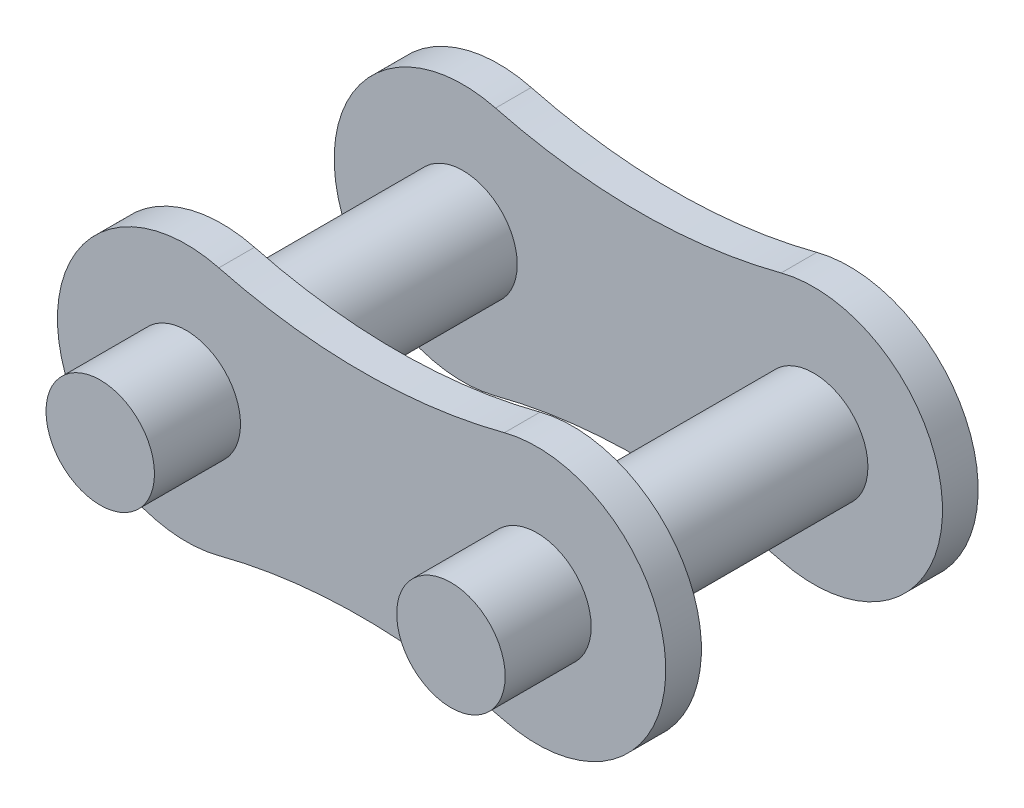
ISO-10303-21;
HEADER;
FILE_DESCRIPTION(('STEP AP214'),'2;1');
FILE_NAME('part.step','',(''),(''),'','','');
FILE_SCHEMA(('AUTOMOTIVE_DESIGN { 1 0 10303 214 1 1 1 1 }'));
ENDSEC;
DATA;
#1=APPLICATION_CONTEXT('core data for automotive mechanical design processes');
#2=APPLICATION_PROTOCOL_DEFINITION('international standard','automotive_design',2000,#1);
#3=PRODUCT_CONTEXT('',#1,'mechanical');
#4=PRODUCT('Part','Part','',(#3));
#5=PRODUCT_RELATED_PRODUCT_CATEGORY('part','',(#4));
#6=PRODUCT_DEFINITION_FORMATION('','',#4);
#7=PRODUCT_DEFINITION_CONTEXT('part definition',#1,'design');
#8=PRODUCT_DEFINITION('design','',#6,#7);
#9=PRODUCT_DEFINITION_SHAPE('','',#8);
#10=(LENGTH_UNIT() NAMED_UNIT(*) SI_UNIT(.MILLI.,.METRE.));
#11=(NAMED_UNIT(*) PLANE_ANGLE_UNIT() SI_UNIT($,.RADIAN.));
#12=(NAMED_UNIT(*) SI_UNIT($,.STERADIAN.) SOLID_ANGLE_UNIT());
#13=UNCERTAINTY_MEASURE_WITH_UNIT(LENGTH_MEASURE(1.E-05),#10,'distance_accuracy_value','');
#14=(GEOMETRIC_REPRESENTATION_CONTEXT(3) GLOBAL_UNCERTAINTY_ASSIGNED_CONTEXT((#13)) GLOBAL_UNIT_ASSIGNED_CONTEXT((#10,
#11,#12)) REPRESENTATION_CONTEXT('',''));
#15=CARTESIAN_POINT('',(0.,0.,0.));
#16=DIRECTION('',(0.,0.,1.));
#17=DIRECTION('',(1.,0.,0.));
#18=AXIS2_PLACEMENT_3D('',#15,#16,#17);
#19=CARTESIAN_POINT('',(5.9944,11.4708256819023,-2.67));
#20=DIRECTION('',(0.,0.,1.));
#21=DIRECTION('',(1.,0.,0.));
#22=AXIS2_PLACEMENT_3D('',#19,#20,#21);
#23=CYLINDRICAL_SURFACE('',#22,9.6542568824027);
#24=CARTESIAN_POINT('',(5.9944,11.4708256819023,-2.0604));
#25=DIRECTION('',(0.,0.,-1.));
#26=DIRECTION('',(1.,0.,0.));
#27=AXIS2_PLACEMENT_3D('',#24,#25,#26);
#28=CIRCLE('',#27,9.6542568824027);
#29=CARTESIAN_POINT('',(8.43501338550079,2.13015749092509,-2.0604));
#30=VERTEX_POINT('',#29);
#31=CARTESIAN_POINT('',(3.55378661449922,2.13015749092509,-2.0604));
#32=VERTEX_POINT('',#31);
#33=EDGE_CURVE('E161',#30,#32,#28,.T.);
#34=ORIENTED_EDGE('',*,*,#33,.F.);
#35=DIRECTION('',(0.,0.,1.));
#36=VECTOR('',#35,1.);
#37=CARTESIAN_POINT('',(8.43501338550079,2.13015749092509,-2.67));
#38=LINE('',#37,#36);
#39=CARTESIAN_POINT('',(8.43501338550079,2.13015749092509,-2.67));
#40=VERTEX_POINT('',#39);
#41=EDGE_CURVE('E11',#40,#30,#38,.T.);
#42=ORIENTED_EDGE('',*,*,#41,.F.);
#43=CARTESIAN_POINT('',(5.9944,11.4708256819023,-2.67));
#44=DIRECTION('',(0.,0.,-1.));
#45=DIRECTION('',(1.,0.,0.));
#46=AXIS2_PLACEMENT_3D('',#43,#44,#45);
#47=CIRCLE('',#46,9.6542568824027);
#48=CARTESIAN_POINT('',(3.55378661449922,2.13015749092509,-2.67));
#49=VERTEX_POINT('',#48);
#50=EDGE_CURVE('E162',#40,#49,#47,.T.);
#51=ORIENTED_EDGE('',*,*,#50,.T.);
#52=DIRECTION('',(0.,0.,1.));
#53=VECTOR('',#52,1.);
#54=CARTESIAN_POINT('',(3.55378661449922,2.13015749092509,-2.67));
#55=LINE('',#54,#53);
#56=EDGE_CURVE('E39',#49,#32,#55,.T.);
#57=ORIENTED_EDGE('',*,*,#56,.T.);
#58=EDGE_LOOP('',(#34,#42,#51,#57));
#59=FACE_BOUND('',#58,.T.);
#60=ADVANCED_FACE('F36',(#59),#23,.F.);
#61=CARTESIAN_POINT('',(8.9916,0.,-2.67));
#62=DIRECTION('',(0.,0.,1.));
#63=DIRECTION('',(1.,0.,0.));
#64=AXIS2_PLACEMENT_3D('',#61,#62,#63);
#65=CYLINDRICAL_SURFACE('',#64,2.20167199999999);
#66=CARTESIAN_POINT('',(8.9916,0.,-2.0604));
#67=DIRECTION('',(0.,0.,1.));
#68=DIRECTION('',(1.,0.,0.));
#69=AXIS2_PLACEMENT_3D('',#66,#67,#68);
#70=CIRCLE('',#69,2.20167199999999);
#71=CARTESIAN_POINT('',(8.43501338550078,-2.13015749092509,-2.0604));
#72=VERTEX_POINT('',#71);
#73=EDGE_CURVE('E165',#72,#30,#70,.T.);
#74=ORIENTED_EDGE('',*,*,#73,.F.);
#75=DIRECTION('',(0.,0.,1.));
#76=VECTOR('',#75,1.);
#77=CARTESIAN_POINT('',(8.43501338550078,-2.13015749092509,-2.67));
#78=LINE('',#77,#76);
#79=CARTESIAN_POINT('',(8.43501338550078,-2.13015749092509,-2.67));
#80=VERTEX_POINT('',#79);
#81=EDGE_CURVE('E45',#80,#72,#78,.T.);
#82=ORIENTED_EDGE('',*,*,#81,.F.);
#83=CARTESIAN_POINT('',(8.9916,0.,-2.67));
#84=DIRECTION('',(0.,0.,1.));
#85=DIRECTION('',(1.,0.,0.));
#86=AXIS2_PLACEMENT_3D('',#83,#84,#85);
#87=CIRCLE('',#86,2.20167199999999);
#88=EDGE_CURVE('E169',#80,#40,#87,.T.);
#89=ORIENTED_EDGE('',*,*,#88,.T.);
#90=ORIENTED_EDGE('',*,*,#41,.T.);
#91=EDGE_LOOP('',(#74,#82,#89,#90));
#92=FACE_BOUND('',#91,.T.);
#93=ADVANCED_FACE('F184',(#92),#65,.T.);
#94=CARTESIAN_POINT('',(5.9944,-11.4708256819023,-2.67));
#95=DIRECTION('',(0.,0.,1.));
#96=DIRECTION('',(1.,0.,0.));
#97=AXIS2_PLACEMENT_3D('',#94,#95,#96);
#98=CYLINDRICAL_SURFACE('',#97,9.6542568824027);
#99=CARTESIAN_POINT('',(5.9944,-11.4708256819023,-2.0604));
#100=DIRECTION('',(0.,0.,-1.));
#101=DIRECTION('',(-1.,0.,0.));
#102=AXIS2_PLACEMENT_3D('',#99,#100,#101);
#103=CIRCLE('',#102,9.6542568824027);
#104=CARTESIAN_POINT('',(3.55378661449922,-2.13015749092509,-2.0604));
#105=VERTEX_POINT('',#104);
#106=EDGE_CURVE('E176',#105,#72,#103,.T.);
#107=ORIENTED_EDGE('',*,*,#106,.F.);
#108=DIRECTION('',(0.,0.,1.));
#109=VECTOR('',#108,1.);
#110=CARTESIAN_POINT('',(3.55378661449922,-2.13015749092509,-2.67));
#111=LINE('',#110,#109);
#112=CARTESIAN_POINT('',(3.55378661449922,-2.13015749092509,-2.67));
#113=VERTEX_POINT('',#112);
#114=EDGE_CURVE('E180',#113,#105,#111,.T.);
#115=ORIENTED_EDGE('',*,*,#114,.F.);
#116=CARTESIAN_POINT('',(5.9944,-11.4708256819023,-2.67));
#117=DIRECTION('',(0.,0.,-1.));
#118=DIRECTION('',(-1.,0.,0.));
#119=AXIS2_PLACEMENT_3D('',#116,#117,#118);
#120=CIRCLE('',#119,9.6542568824027);
#121=EDGE_CURVE('E167',#113,#80,#120,.T.);
#122=ORIENTED_EDGE('',*,*,#121,.T.);
#123=ORIENTED_EDGE('',*,*,#81,.T.);
#124=EDGE_LOOP('',(#107,#115,#122,#123));
#125=FACE_BOUND('',#124,.T.);
#126=ADVANCED_FACE('F187',(#125),#98,.F.);
#127=CARTESIAN_POINT('',(2.9972,0.,-2.67));
#128=DIRECTION('',(0.,0.,1.));
#129=DIRECTION('',(1.,0.,0.));
#130=AXIS2_PLACEMENT_3D('',#127,#128,#129);
#131=CYLINDRICAL_SURFACE('',#130,2.20167199999999);
#132=CARTESIAN_POINT('',(2.9972,0.,-2.0604));
#133=DIRECTION('',(0.,0.,1.));
#134=DIRECTION('',(1.,0.,0.));
#135=AXIS2_PLACEMENT_3D('',#132,#133,#134);
#136=CIRCLE('',#135,2.20167199999999);
#137=EDGE_CURVE('E173',#32,#105,#136,.T.);
#138=ORIENTED_EDGE('',*,*,#137,.F.);
#139=ORIENTED_EDGE('',*,*,#56,.F.);
#140=CARTESIAN_POINT('',(2.9972,0.,-2.67));
#141=DIRECTION('',(0.,0.,1.));
#142=DIRECTION('',(1.,0.,0.));
#143=AXIS2_PLACEMENT_3D('',#140,#141,#142);
#144=CIRCLE('',#143,2.20167199999999);
#145=EDGE_CURVE('E164',#49,#113,#144,.T.);
#146=ORIENTED_EDGE('',*,*,#145,.T.);
#147=ORIENTED_EDGE('',*,*,#114,.T.);
#148=EDGE_LOOP('',(#138,#139,#146,#147));
#149=FACE_BOUND('',#148,.T.);
#150=ADVANCED_FACE('F181',(#149),#131,.T.);
#151=CARTESIAN_POINT('',(7.493,5.73541284095117,-2.67));
#152=DIRECTION('',(0.,0.,1.));
#153=DIRECTION('',(1.,0.,0.));
#154=AXIS2_PLACEMENT_3D('',#151,#152,#153);
#155=PLANE('',#154);
#156=CARTESIAN_POINT('',(8.9916,0.,-2.67));
#157=DIRECTION('',(0.,0.,1.));
#158=DIRECTION('',(1.,0.,0.));
#159=AXIS2_PLACEMENT_3D('',#156,#157,#158);
#160=CIRCLE('',#159,0.927100000000001);
#161=CARTESIAN_POINT('',(9.9187,0.,-2.67));
#162=VERTEX_POINT('',#161);
#163=EDGE_CURVE('E152',#162,#162,#160,.F.);
#164=ORIENTED_EDGE('',*,*,#163,.F.);
#165=EDGE_LOOP('',(#164));
#166=FACE_BOUND('',#165,.T.);
#167=CARTESIAN_POINT('',(2.9972,0.,-2.67));
#168=DIRECTION('',(0.,0.,1.));
#169=DIRECTION('',(1.,0.,0.));
#170=AXIS2_PLACEMENT_3D('',#167,#168,#169);
#171=CIRCLE('',#170,0.9271);
#172=CARTESIAN_POINT('',(3.9243,0.,-2.67));
#173=VERTEX_POINT('',#172);
#174=EDGE_CURVE('E149',#173,#173,#171,.F.);
#175=ORIENTED_EDGE('',*,*,#174,.F.);
#176=EDGE_LOOP('',(#175));
#177=FACE_BOUND('',#176,.T.);
#178=ORIENTED_EDGE('',*,*,#50,.F.);
#179=ORIENTED_EDGE('',*,*,#88,.F.);
#180=ORIENTED_EDGE('',*,*,#121,.F.);
#181=ORIENTED_EDGE('',*,*,#145,.F.);
#182=EDGE_LOOP('',(#178,#179,#180,#181));
#183=FACE_BOUND('',#182,.T.);
#184=ADVANCED_FACE('F189',(#166,#177,#183),#155,.F.);
#185=CARTESIAN_POINT('',(7.493,5.73541284095117,-2.0604));
#186=DIRECTION('',(0.,0.,1.));
#187=DIRECTION('',(1.,0.,0.));
#188=AXIS2_PLACEMENT_3D('',#185,#186,#187);
#189=PLANE('',#188);
#190=CARTESIAN_POINT('',(8.9916,0.,-2.0604));
#191=DIRECTION('',(0.,0.,1.));
#192=DIRECTION('',(1.,0.,0.));
#193=AXIS2_PLACEMENT_3D('',#190,#191,#192);
#194=CIRCLE('',#193,0.927100000000001);
#195=CARTESIAN_POINT('',(9.9187,0.,-2.0604));
#196=VERTEX_POINT('',#195);
#197=EDGE_CURVE('E155',#196,#196,#194,.T.);
#198=ORIENTED_EDGE('',*,*,#197,.F.);
#199=EDGE_LOOP('',(#198));
#200=FACE_BOUND('',#199,.T.);
#201=CARTESIAN_POINT('',(2.9972,0.,-2.0604));
#202=DIRECTION('',(0.,0.,1.));
#203=DIRECTION('',(1.,0.,0.));
#204=AXIS2_PLACEMENT_3D('',#201,#202,#203);
#205=CIRCLE('',#204,0.9271);
#206=CARTESIAN_POINT('',(3.9243,0.,-2.0604));
#207=VERTEX_POINT('',#206);
#208=EDGE_CURVE('E158',#207,#207,#205,.T.);
#209=ORIENTED_EDGE('',*,*,#208,.F.);
#210=EDGE_LOOP('',(#209));
#211=FACE_BOUND('',#210,.T.);
#212=ORIENTED_EDGE('',*,*,#33,.T.);
#213=ORIENTED_EDGE('',*,*,#137,.T.);
#214=ORIENTED_EDGE('',*,*,#106,.T.);
#215=ORIENTED_EDGE('',*,*,#73,.T.);
#216=EDGE_LOOP('',(#212,#213,#214,#215));
#217=FACE_BOUND('',#216,.T.);
#218=ADVANCED_FACE('F183',(#200,#211,#217),#189,.T.);
#219=CARTESIAN_POINT('',(2.9972,0.,4.1402));
#220=DIRECTION('',(0.,0.,-1.));
#221=DIRECTION('',(-1.,0.,0.));
#222=AXIS2_PLACEMENT_3D('',#219,#220,#221);
#223=CYLINDRICAL_SURFACE('',#222,0.9271);
#224=ORIENTED_EDGE('',*,*,#208,.T.);
#225=EDGE_LOOP('',(#224));
#226=FACE_BOUND('',#225,.T.);
#227=CARTESIAN_POINT('',(2.9972,0.,2.0604));
#228=DIRECTION('',(0.,0.,1.));
#229=DIRECTION('',(1.,0.,0.));
#230=AXIS2_PLACEMENT_3D('',#227,#228,#229);
#231=CIRCLE('',#230,0.9271);
#232=CARTESIAN_POINT('',(3.9243,0.,2.0604));
#233=VERTEX_POINT('',#232);
#234=EDGE_CURVE('E405',#233,#233,#231,.T.);
#235=ORIENTED_EDGE('',*,*,#234,.F.);
#236=EDGE_LOOP('',(#235));
#237=FACE_BOUND('',#236,.T.);
#238=ADVANCED_FACE('F197',(#226,#237),#223,.T.);
#239=CARTESIAN_POINT('',(8.9916,0.,4.1402));
#240=DIRECTION('',(0.,0.,1.));
#241=DIRECTION('',(1.,0.,0.));
#242=AXIS2_PLACEMENT_3D('',#239,#240,#241);
#243=PLANE('',#242);
#244=CARTESIAN_POINT('',(8.9916,0.,4.1402));
#245=DIRECTION('',(0.,0.,1.));
#246=DIRECTION('',(1.,0.,0.));
#247=AXIS2_PLACEMENT_3D('',#244,#245,#246);
#248=CIRCLE('',#247,0.927100000000001);
#249=CARTESIAN_POINT('',(9.9187,0.,4.1402));
#250=VERTEX_POINT('',#249);
#251=EDGE_CURVE('E428',#250,#250,#248,.T.);
#252=ORIENTED_EDGE('',*,*,#251,.T.);
#253=EDGE_LOOP('',(#252));
#254=FACE_BOUND('',#253,.T.);
#255=ADVANCED_FACE('F359',(#254),#243,.T.);
#256=CARTESIAN_POINT('',(8.9916,0.,4.1402));
#257=DIRECTION('',(0.,0.,-1.));
#258=DIRECTION('',(-1.,0.,0.));
#259=AXIS2_PLACEMENT_3D('',#256,#257,#258);
#260=CYLINDRICAL_SURFACE('',#259,0.927100000000001);
#261=ORIENTED_EDGE('',*,*,#251,.F.);
#262=EDGE_LOOP('',(#261));
#263=FACE_BOUND('',#262,.T.);
#264=CARTESIAN_POINT('',(8.9916,0.,2.67));
#265=DIRECTION('',(0.,0.,1.));
#266=DIRECTION('',(1.,0.,0.));
#267=AXIS2_PLACEMENT_3D('',#264,#265,#266);
#268=CIRCLE('',#267,0.927100000000001);
#269=CARTESIAN_POINT('',(9.9187,0.,2.67));
#270=VERTEX_POINT('',#269);
#271=EDGE_CURVE('E407',#270,#270,#268,.T.);
#272=ORIENTED_EDGE('',*,*,#271,.T.);
#273=EDGE_LOOP('',(#272));
#274=FACE_BOUND('',#273,.T.);
#275=ADVANCED_FACE('F249',(#263,#274),#260,.T.);
#276=ORIENTED_EDGE('',*,*,#197,.T.);
#277=EDGE_LOOP('',(#276));
#278=FACE_BOUND('',#277,.T.);
#279=CARTESIAN_POINT('',(8.9916,0.,2.0604));
#280=DIRECTION('',(0.,0.,-1.));
#281=DIRECTION('',(-1.,0.,0.));
#282=AXIS2_PLACEMENT_3D('',#279,#280,#281);
#283=CIRCLE('',#282,0.927100000000001);
#284=CARTESIAN_POINT('',(8.0645,0.,2.0604));
#285=VERTEX_POINT('',#284);
#286=EDGE_CURVE('E412',#285,#285,#283,.F.);
#287=ORIENTED_EDGE('',*,*,#286,.F.);
#288=EDGE_LOOP('',(#287));
#289=FACE_BOUND('',#288,.T.);
#290=ADVANCED_FACE('F250',(#278,#289),#260,.T.);
#291=CARTESIAN_POINT('',(7.493,5.73541284095117,2.0604));
#292=DIRECTION('',(0.,0.,-1.));
#293=DIRECTION('',(1.,0.,0.));
#294=AXIS2_PLACEMENT_3D('',#291,#292,#293);
#295=PLANE('',#294);
#296=ORIENTED_EDGE('',*,*,#286,.T.);
#297=EDGE_LOOP('',(#296));
#298=FACE_BOUND('',#297,.T.);
#299=ORIENTED_EDGE('',*,*,#234,.T.);
#300=EDGE_LOOP('',(#299));
#301=FACE_BOUND('',#300,.T.);
#302=CARTESIAN_POINT('',(5.9944,11.4708256819023,2.0604));
#303=DIRECTION('',(0.,0.,-1.));
#304=DIRECTION('',(1.,0.,0.));
#305=AXIS2_PLACEMENT_3D('',#302,#303,#304);
#306=CIRCLE('',#305,9.6542568824027);
#307=CARTESIAN_POINT('',(8.43501338550079,2.13015749092509,2.0604));
#308=VERTEX_POINT('',#307);
#309=CARTESIAN_POINT('',(3.55378661449922,2.13015749092509,2.0604));
#310=VERTEX_POINT('',#309);
#311=EDGE_CURVE('E132',#308,#310,#306,.T.);
#312=ORIENTED_EDGE('',*,*,#311,.F.);
#313=CARTESIAN_POINT('',(8.9916,0.,2.0604));
#314=DIRECTION('',(0.,0.,1.));
#315=DIRECTION('',(1.,0.,0.));
#316=AXIS2_PLACEMENT_3D('',#313,#314,#315);
#317=CIRCLE('',#316,2.20167199999999);
#318=CARTESIAN_POINT('',(8.43501338550078,-2.13015749092509,2.0604));
#319=VERTEX_POINT('',#318);
#320=EDGE_CURVE('E128',#319,#308,#317,.T.);
#321=ORIENTED_EDGE('',*,*,#320,.F.);
#322=CARTESIAN_POINT('',(5.9944,-11.4708256819023,2.0604));
#323=DIRECTION('',(0.,0.,-1.));
#324=DIRECTION('',(-1.,0.,0.));
#325=AXIS2_PLACEMENT_3D('',#322,#323,#324);
#326=CIRCLE('',#325,9.6542568824027);
#327=CARTESIAN_POINT('',(3.55378661449922,-2.13015749092509,2.0604));
#328=VERTEX_POINT('',#327);
#329=EDGE_CURVE('E418',#328,#319,#326,.T.);
#330=ORIENTED_EDGE('',*,*,#329,.F.);
#331=CARTESIAN_POINT('',(2.9972,0.,2.0604));
#332=DIRECTION('',(0.,0.,1.));
#333=DIRECTION('',(1.,0.,0.));
#334=AXIS2_PLACEMENT_3D('',#331,#332,#333);
#335=CIRCLE('',#334,2.20167199999999);
#336=EDGE_CURVE('E409',#310,#328,#335,.T.);
#337=ORIENTED_EDGE('',*,*,#336,.F.);
#338=EDGE_LOOP('',(#312,#321,#330,#337));
#339=FACE_BOUND('',#338,.T.);
#340=ADVANCED_FACE('F324',(#298,#301,#339),#295,.T.);
#341=CARTESIAN_POINT('',(7.493,5.73541284095117,2.67));
#342=DIRECTION('',(0.,0.,-1.));
#343=DIRECTION('',(1.,0.,0.));
#344=AXIS2_PLACEMENT_3D('',#341,#342,#343);
#345=PLANE('',#344);
#346=ORIENTED_EDGE('',*,*,#271,.F.);
#347=EDGE_LOOP('',(#346));
#348=FACE_BOUND('',#347,.T.);
#349=CARTESIAN_POINT('',(2.9972,0.,2.67));
#350=DIRECTION('',(0.,0.,-1.));
#351=DIRECTION('',(-1.,0.,0.));
#352=AXIS2_PLACEMENT_3D('',#349,#350,#351);
#353=CIRCLE('',#352,0.9271);
#354=CARTESIAN_POINT('',(2.0701,0.,2.67));
#355=VERTEX_POINT('',#354);
#356=EDGE_CURVE('E146',#355,#355,#353,.T.);
#357=ORIENTED_EDGE('',*,*,#356,.T.);
#358=EDGE_LOOP('',(#357));
#359=FACE_BOUND('',#358,.T.);
#360=CARTESIAN_POINT('',(5.9944,11.4708256819023,2.67));
#361=DIRECTION('',(0.,0.,-1.));
#362=DIRECTION('',(1.,0.,0.));
#363=AXIS2_PLACEMENT_3D('',#360,#361,#362);
#364=CIRCLE('',#363,9.6542568824027);
#365=CARTESIAN_POINT('',(8.43501338550079,2.13015749092509,2.67));
#366=VERTEX_POINT('',#365);
#367=CARTESIAN_POINT('',(3.55378661449922,2.13015749092509,2.67));
#368=VERTEX_POINT('',#367);
#369=EDGE_CURVE('E119',#366,#368,#364,.T.);
#370=ORIENTED_EDGE('',*,*,#369,.T.);
#371=CARTESIAN_POINT('',(2.9972,0.,2.67));
#372=DIRECTION('',(0.,0.,1.));
#373=DIRECTION('',(1.,0.,0.));
#374=AXIS2_PLACEMENT_3D('',#371,#372,#373);
#375=CIRCLE('',#374,2.20167199999999);
#376=CARTESIAN_POINT('',(3.55378661449922,-2.13015749092509,2.67));
#377=VERTEX_POINT('',#376);
#378=EDGE_CURVE('E108',#368,#377,#375,.T.);
#379=ORIENTED_EDGE('',*,*,#378,.T.);
#380=CARTESIAN_POINT('',(5.9944,-11.4708256819023,2.67));
#381=DIRECTION('',(0.,0.,-1.));
#382=DIRECTION('',(-1.,0.,0.));
#383=AXIS2_PLACEMENT_3D('',#380,#381,#382);
#384=CIRCLE('',#383,9.6542568824027);
#385=CARTESIAN_POINT('',(8.43501338550078,-2.13015749092509,2.67));
#386=VERTEX_POINT('',#385);
#387=EDGE_CURVE('E118',#377,#386,#384,.T.);
#388=ORIENTED_EDGE('',*,*,#387,.T.);
#389=CARTESIAN_POINT('',(8.9916,0.,2.67));
#390=DIRECTION('',(0.,0.,1.));
#391=DIRECTION('',(1.,0.,0.));
#392=AXIS2_PLACEMENT_3D('',#389,#390,#391);
#393=CIRCLE('',#392,2.20167199999999);
#394=EDGE_CURVE('E124',#386,#366,#393,.T.);
#395=ORIENTED_EDGE('',*,*,#394,.T.);
#396=EDGE_LOOP('',(#370,#379,#388,#395));
#397=FACE_BOUND('',#396,.T.);
#398=ADVANCED_FACE('F122',(#348,#359,#397),#345,.F.);
#399=CARTESIAN_POINT('',(2.9972,0.,2.67));
#400=DIRECTION('',(0.,0.,-1.));
#401=DIRECTION('',(1.,0.,0.));
#402=AXIS2_PLACEMENT_3D('',#399,#400,#401);
#403=CYLINDRICAL_SURFACE('',#402,2.20167199999999);
#404=ORIENTED_EDGE('',*,*,#336,.T.);
#405=DIRECTION('',(0.,0.,-1.));
#406=VECTOR('',#405,1.);
#407=CARTESIAN_POINT('',(3.55378661449922,-2.13015749092509,2.67));
#408=LINE('',#407,#406);
#409=EDGE_CURVE('E115',#377,#328,#408,.T.);
#410=ORIENTED_EDGE('',*,*,#409,.F.);
#411=ORIENTED_EDGE('',*,*,#378,.F.);
#412=DIRECTION('',(0.,0.,-1.));
#413=VECTOR('',#412,1.);
#414=CARTESIAN_POINT('',(3.55378661449922,2.13015749092509,2.67));
#415=LINE('',#414,#413);
#416=EDGE_CURVE('E112',#368,#310,#415,.T.);
#417=ORIENTED_EDGE('',*,*,#416,.T.);
#418=EDGE_LOOP('',(#404,#410,#411,#417));
#419=FACE_BOUND('',#418,.T.);
#420=ADVANCED_FACE('F110',(#419),#403,.T.);
#421=CARTESIAN_POINT('',(5.9944,-11.4708256819023,2.67));
#422=DIRECTION('',(0.,0.,-1.));
#423=DIRECTION('',(1.,0.,0.));
#424=AXIS2_PLACEMENT_3D('',#421,#422,#423);
#425=CYLINDRICAL_SURFACE('',#424,9.6542568824027);
#426=ORIENTED_EDGE('',*,*,#329,.T.);
#427=DIRECTION('',(0.,0.,-1.));
#428=VECTOR('',#427,1.);
#429=CARTESIAN_POINT('',(8.43501338550078,-2.13015749092509,2.67));
#430=LINE('',#429,#428);
#431=EDGE_CURVE('E134',#386,#319,#430,.T.);
#432=ORIENTED_EDGE('',*,*,#431,.F.);
#433=ORIENTED_EDGE('',*,*,#387,.F.);
#434=ORIENTED_EDGE('',*,*,#409,.T.);
#435=EDGE_LOOP('',(#426,#432,#433,#434));
#436=FACE_BOUND('',#435,.T.);
#437=ADVANCED_FACE('F297',(#436),#425,.F.);
#438=CARTESIAN_POINT('',(8.9916,0.,2.67));
#439=DIRECTION('',(0.,0.,-1.));
#440=DIRECTION('',(1.,0.,0.));
#441=AXIS2_PLACEMENT_3D('',#438,#439,#440);
#442=CYLINDRICAL_SURFACE('',#441,2.20167199999999);
#443=ORIENTED_EDGE('',*,*,#320,.T.);
#444=DIRECTION('',(0.,0.,-1.));
#445=VECTOR('',#444,1.);
#446=CARTESIAN_POINT('',(8.43501338550079,2.13015749092509,2.67));
#447=LINE('',#446,#445);
#448=EDGE_CURVE('E143',#366,#308,#447,.T.);
#449=ORIENTED_EDGE('',*,*,#448,.F.);
#450=ORIENTED_EDGE('',*,*,#394,.F.);
#451=ORIENTED_EDGE('',*,*,#431,.T.);
#452=EDGE_LOOP('',(#443,#449,#450,#451));
#453=FACE_BOUND('',#452,.T.);
#454=ADVANCED_FACE('F288',(#453),#442,.T.);
#455=CARTESIAN_POINT('',(5.9944,11.4708256819023,2.67));
#456=DIRECTION('',(0.,0.,-1.));
#457=DIRECTION('',(1.,0.,0.));
#458=AXIS2_PLACEMENT_3D('',#455,#456,#457);
#459=CYLINDRICAL_SURFACE('',#458,9.6542568824027);
#460=ORIENTED_EDGE('',*,*,#311,.T.);
#461=ORIENTED_EDGE('',*,*,#416,.F.);
#462=ORIENTED_EDGE('',*,*,#369,.F.);
#463=ORIENTED_EDGE('',*,*,#448,.T.);
#464=EDGE_LOOP('',(#460,#461,#462,#463));
#465=FACE_BOUND('',#464,.T.);
#466=ADVANCED_FACE('F130',(#465),#459,.F.);
#467=CARTESIAN_POINT('',(2.9972,0.,4.1402));
#468=DIRECTION('',(0.,0.,1.));
#469=DIRECTION('',(1.,0.,0.));
#470=AXIS2_PLACEMENT_3D('',#467,#468,#469);
#471=PLANE('',#470);
#472=CARTESIAN_POINT('',(2.9972,0.,4.1402));
#473=DIRECTION('',(0.,0.,1.));
#474=DIRECTION('',(1.,0.,0.));
#475=AXIS2_PLACEMENT_3D('',#472,#473,#474);
#476=CIRCLE('',#475,0.9271);
#477=CARTESIAN_POINT('',(3.9243,0.,4.1402));
#478=VERTEX_POINT('',#477);
#479=EDGE_CURVE('E142',#478,#478,#476,.T.);
#480=ORIENTED_EDGE('',*,*,#479,.T.);
#481=EDGE_LOOP('',(#480));
#482=FACE_BOUND('',#481,.T.);
#483=ADVANCED_FACE('F270',(#482),#471,.T.);
#484=ORIENTED_EDGE('',*,*,#479,.F.);
#485=EDGE_LOOP('',(#484));
#486=FACE_BOUND('',#485,.T.);
#487=ORIENTED_EDGE('',*,*,#356,.F.);
#488=EDGE_LOOP('',(#487));
#489=FACE_BOUND('',#488,.T.);
#490=ADVANCED_FACE('F261',(#486,#489),#223,.T.);
#491=CARTESIAN_POINT('',(2.9972,0.,-3.2512));
#492=DIRECTION('',(0.,0.,1.));
#493=DIRECTION('',(1.,0.,0.));
#494=AXIS2_PLACEMENT_3D('',#491,#492,#493);
#495=PLANE('',#494);
#496=CARTESIAN_POINT('',(2.9972,0.,-3.2512));
#497=DIRECTION('',(0.,0.,1.));
#498=DIRECTION('',(1.,0.,0.));
#499=AXIS2_PLACEMENT_3D('',#496,#497,#498);
#500=CIRCLE('',#499,0.9271);
#501=CARTESIAN_POINT('',(3.9243,0.,-3.2512));
#502=VERTEX_POINT('',#501);
#503=EDGE_CURVE('E139',#502,#502,#500,.T.);
#504=ORIENTED_EDGE('',*,*,#503,.F.);
#505=EDGE_LOOP('',(#504));
#506=FACE_BOUND('',#505,.T.);
#507=ADVANCED_FACE('F259',(#506),#495,.F.);
#508=ORIENTED_EDGE('',*,*,#503,.T.);
#509=EDGE_LOOP('',(#508));
#510=FACE_BOUND('',#509,.T.);
#511=ORIENTED_EDGE('',*,*,#174,.T.);
#512=EDGE_LOOP('',(#511));
#513=FACE_BOUND('',#512,.T.);
#514=ADVANCED_FACE('F246',(#510,#513),#223,.T.);
#515=CARTESIAN_POINT('',(8.9916,0.,-3.2512));
#516=DIRECTION('',(0.,0.,1.));
#517=DIRECTION('',(1.,0.,0.));
#518=AXIS2_PLACEMENT_3D('',#515,#516,#517);
#519=CIRCLE('',#518,0.927100000000001);
#520=CARTESIAN_POINT('',(9.9187,0.,-3.2512));
#521=VERTEX_POINT('',#520);
#522=EDGE_CURVE('E431',#521,#521,#519,.T.);
#523=ORIENTED_EDGE('',*,*,#522,.T.);
#524=EDGE_LOOP('',(#523));
#525=FACE_BOUND('',#524,.T.);
#526=ORIENTED_EDGE('',*,*,#163,.T.);
#527=EDGE_LOOP('',(#526));
#528=FACE_BOUND('',#527,.T.);
#529=ADVANCED_FACE('F239',(#525,#528),#260,.T.);
#530=CARTESIAN_POINT('',(8.9916,0.,-3.2512));
#531=DIRECTION('',(0.,0.,1.));
#532=DIRECTION('',(1.,0.,0.));
#533=AXIS2_PLACEMENT_3D('',#530,#531,#532);
#534=PLANE('',#533);
#535=ORIENTED_EDGE('',*,*,#522,.F.);
#536=EDGE_LOOP('',(#535));
#537=FACE_BOUND('',#536,.T.);
#538=ADVANCED_FACE('F245',(#537),#534,.F.);
#539=CLOSED_SHELL('',(#60,#93,#126,#150,#184,#218,#238,#255,#275,#290,#340,#398,#420,#437,#454,
#466,#483,#490,#507,#514,#529,#538));
#540=MANIFOLD_SOLID_BREP('B2',#539);
#541=ADVANCED_BREP_SHAPE_REPRESENTATION('',(#18,#540),#14);
#542=SHAPE_DEFINITION_REPRESENTATION(#9,#541);
ENDSEC;
END-ISO-10303-21;
